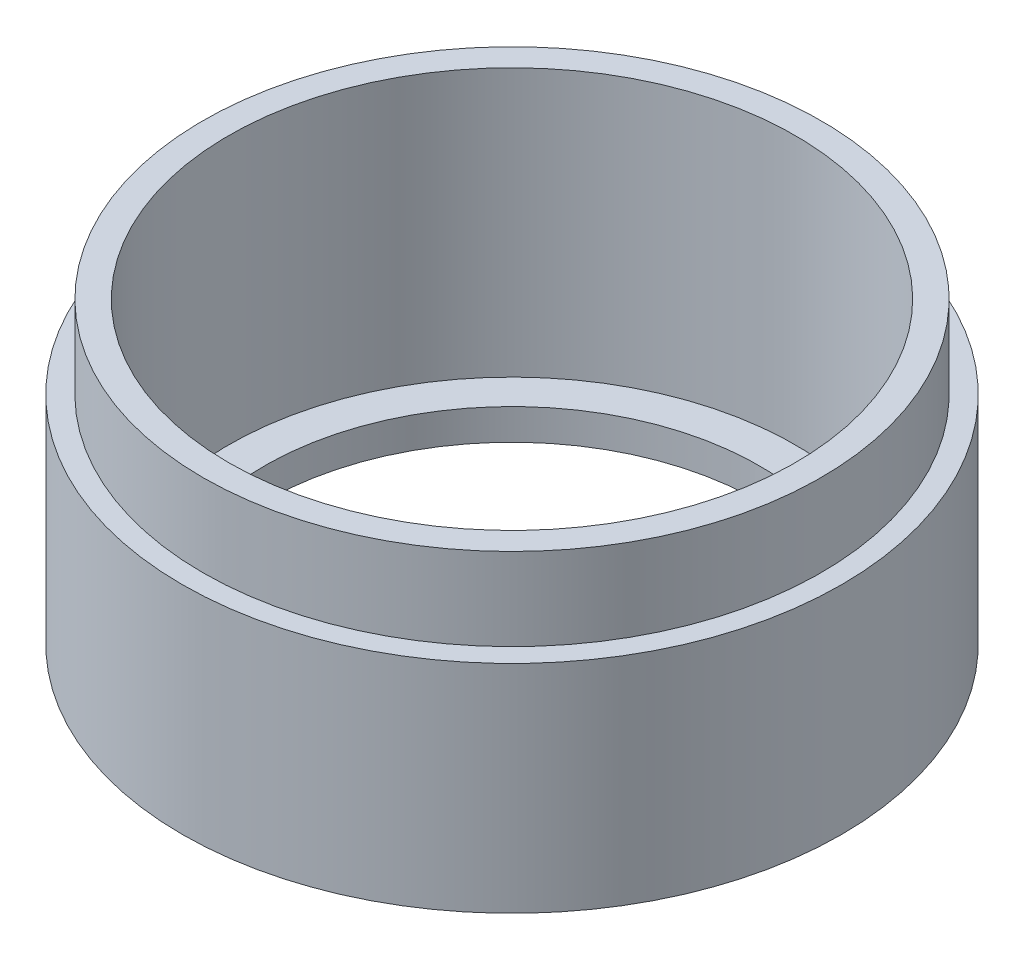
ISO-10303-21;
HEADER;
FILE_DESCRIPTION(('STEP AP214'),'2;1');
FILE_NAME('part.step','',(''),(''),'','','');
FILE_SCHEMA(('AUTOMOTIVE_DESIGN { 1 0 10303 214 1 1 1 1 }'));
ENDSEC;
DATA;
#1=APPLICATION_CONTEXT('core data for automotive mechanical design processes');
#2=APPLICATION_PROTOCOL_DEFINITION('international standard','automotive_design',2000,#1);
#3=PRODUCT_CONTEXT('',#1,'mechanical');
#4=PRODUCT('Part','Part','',(#3));
#5=PRODUCT_RELATED_PRODUCT_CATEGORY('part','',(#4));
#6=PRODUCT_DEFINITION_FORMATION('','',#4);
#7=PRODUCT_DEFINITION_CONTEXT('part definition',#1,'design');
#8=PRODUCT_DEFINITION('design','',#6,#7);
#9=PRODUCT_DEFINITION_SHAPE('','',#8);
#10=(LENGTH_UNIT() NAMED_UNIT(*) SI_UNIT(.MILLI.,.METRE.));
#11=(NAMED_UNIT(*) PLANE_ANGLE_UNIT() SI_UNIT($,.RADIAN.));
#12=(NAMED_UNIT(*) SI_UNIT($,.STERADIAN.) SOLID_ANGLE_UNIT());
#13=UNCERTAINTY_MEASURE_WITH_UNIT(LENGTH_MEASURE(1.E-05),#10,'distance_accuracy_value','');
#14=(GEOMETRIC_REPRESENTATION_CONTEXT(3) GLOBAL_UNCERTAINTY_ASSIGNED_CONTEXT((#13)) GLOBAL_UNIT_ASSIGNED_CONTEXT((#10,
#11,#12)) REPRESENTATION_CONTEXT('',''));
#15=CARTESIAN_POINT('',(0.,0.,0.));
#16=DIRECTION('',(0.,0.,1.));
#17=DIRECTION('',(1.,0.,0.));
#18=AXIS2_PLACEMENT_3D('',#15,#16,#17);
#19=CARTESIAN_POINT('',(32.,-49.4943699492636,0.));
#20=DIRECTION('',(0.,1.,0.));
#21=DIRECTION('',(0.,0.,1.));
#22=AXIS2_PLACEMENT_3D('',#19,#20,#21);
#23=PLANE('',#22);
#24=CARTESIAN_POINT('',(0.,-49.4943699492636,0.));
#25=DIRECTION('',(0.,1.,0.));
#26=DIRECTION('',(0.,0.,1.));
#27=AXIS2_PLACEMENT_3D('',#24,#25,#26);
#28=CIRCLE('',#27,32.);
#29=CARTESIAN_POINT('',(0.,-49.4943699492636,32.));
#30=VERTEX_POINT('',#29);
#31=EDGE_CURVE('E10',#30,#30,#28,.T.);
#32=ORIENTED_EDGE('',*,*,#31,.F.);
#33=EDGE_LOOP('',(#32));
#34=FACE_BOUND('',#33,.T.);
#35=CARTESIAN_POINT('',(0.,-49.4943699492636,0.));
#36=DIRECTION('',(0.,1.,0.));
#37=DIRECTION('',(0.,0.,1.));
#38=AXIS2_PLACEMENT_3D('',#35,#36,#37);
#39=CIRCLE('',#38,24.);
#40=CARTESIAN_POINT('',(0.,-49.4943699492636,24.));
#41=VERTEX_POINT('',#40);
#42=EDGE_CURVE('E58',#41,#41,#39,.T.);
#43=ORIENTED_EDGE('',*,*,#42,.T.);
#44=EDGE_LOOP('',(#43));
#45=FACE_BOUND('',#44,.T.);
#46=ADVANCED_FACE('F30',(#34,#45),#23,.F.);
#47=CARTESIAN_POINT('',(0.,46.0251937984496,0.));
#48=DIRECTION('',(0.,1.,0.));
#49=DIRECTION('',(0.,0.,1.));
#50=AXIS2_PLACEMENT_3D('',#47,#48,#49);
#51=CYLINDRICAL_SURFACE('',#50,32.);
#52=CARTESIAN_POINT('',(0.,-28.4943699492636,0.));
#53=DIRECTION('',(0.,1.,0.));
#54=DIRECTION('',(0.,0.,1.));
#55=AXIS2_PLACEMENT_3D('',#52,#53,#54);
#56=CIRCLE('',#55,32.);
#57=CARTESIAN_POINT('',(0.,-28.4943699492636,32.));
#58=VERTEX_POINT('',#57);
#59=EDGE_CURVE('E36',#58,#58,#56,.T.);
#60=ORIENTED_EDGE('',*,*,#59,.F.);
#61=EDGE_LOOP('',(#60));
#62=FACE_BOUND('',#61,.T.);
#63=ORIENTED_EDGE('',*,*,#31,.T.);
#64=EDGE_LOOP('',(#63));
#65=FACE_BOUND('',#64,.T.);
#66=ADVANCED_FACE('F95',(#62,#65),#51,.T.);
#67=CARTESIAN_POINT('',(30.,-28.4943699492636,0.));
#68=DIRECTION('',(0.,-1.,0.));
#69=DIRECTION('',(0.,0.,-1.));
#70=AXIS2_PLACEMENT_3D('',#67,#68,#69);
#71=PLANE('',#70);
#72=CARTESIAN_POINT('',(0.,-28.4943699492636,0.));
#73=DIRECTION('',(0.,1.,0.));
#74=DIRECTION('',(0.,0.,1.));
#75=AXIS2_PLACEMENT_3D('',#72,#73,#74);
#76=CIRCLE('',#75,30.);
#77=CARTESIAN_POINT('',(0.,-28.4943699492636,30.));
#78=VERTEX_POINT('',#77);
#79=EDGE_CURVE('E40',#78,#78,#76,.T.);
#80=ORIENTED_EDGE('',*,*,#79,.F.);
#81=EDGE_LOOP('',(#80));
#82=FACE_BOUND('',#81,.T.);
#83=ORIENTED_EDGE('',*,*,#59,.T.);
#84=EDGE_LOOP('',(#83));
#85=FACE_BOUND('',#84,.T.);
#86=ADVANCED_FACE('F90',(#82,#85),#71,.F.);
#87=CARTESIAN_POINT('',(0.,46.0251937984496,0.));
#88=DIRECTION('',(0.,1.,0.));
#89=DIRECTION('',(0.,0.,1.));
#90=AXIS2_PLACEMENT_3D('',#87,#88,#89);
#91=CYLINDRICAL_SURFACE('',#90,30.);
#92=CARTESIAN_POINT('',(0.,-20.4943699492636,0.));
#93=DIRECTION('',(0.,1.,0.));
#94=DIRECTION('',(0.,0.,1.));
#95=AXIS2_PLACEMENT_3D('',#92,#93,#94);
#96=CIRCLE('',#95,30.);
#97=CARTESIAN_POINT('',(0.,-20.4943699492636,30.));
#98=VERTEX_POINT('',#97);
#99=EDGE_CURVE('E44',#98,#98,#96,.T.);
#100=ORIENTED_EDGE('',*,*,#99,.F.);
#101=EDGE_LOOP('',(#100));
#102=FACE_BOUND('',#101,.T.);
#103=ORIENTED_EDGE('',*,*,#79,.T.);
#104=EDGE_LOOP('',(#103));
#105=FACE_BOUND('',#104,.T.);
#106=ADVANCED_FACE('F84',(#102,#105),#91,.T.);
#107=CARTESIAN_POINT('',(27.5,-20.4943699492636,0.));
#108=DIRECTION('',(0.,-1.,0.));
#109=DIRECTION('',(0.,0.,-1.));
#110=AXIS2_PLACEMENT_3D('',#107,#108,#109);
#111=PLANE('',#110);
#112=CARTESIAN_POINT('',(0.,-20.4943699492636,0.));
#113=DIRECTION('',(0.,1.,0.));
#114=DIRECTION('',(0.,0.,1.));
#115=AXIS2_PLACEMENT_3D('',#112,#113,#114);
#116=CIRCLE('',#115,27.5);
#117=CARTESIAN_POINT('',(0.,-20.4943699492636,27.5));
#118=VERTEX_POINT('',#117);
#119=EDGE_CURVE('E49',#118,#118,#116,.T.);
#120=ORIENTED_EDGE('',*,*,#119,.F.);
#121=EDGE_LOOP('',(#120));
#122=FACE_BOUND('',#121,.T.);
#123=ORIENTED_EDGE('',*,*,#99,.T.);
#124=EDGE_LOOP('',(#123));
#125=FACE_BOUND('',#124,.T.);
#126=ADVANCED_FACE('F78',(#122,#125),#111,.F.);
#127=CARTESIAN_POINT('',(0.,46.0251937984496,0.));
#128=DIRECTION('',(0.,1.,0.));
#129=DIRECTION('',(0.,0.,1.));
#130=AXIS2_PLACEMENT_3D('',#127,#128,#129);
#131=CYLINDRICAL_SURFACE('',#130,27.5);
#132=CARTESIAN_POINT('',(0.,-46.4943699492636,0.));
#133=DIRECTION('',(0.,1.,0.));
#134=DIRECTION('',(0.,0.,1.));
#135=AXIS2_PLACEMENT_3D('',#132,#133,#134);
#136=CIRCLE('',#135,27.5);
#137=CARTESIAN_POINT('',(0.,-46.4943699492636,27.5));
#138=VERTEX_POINT('',#137);
#139=EDGE_CURVE('E52',#138,#138,#136,.T.);
#140=ORIENTED_EDGE('',*,*,#139,.F.);
#141=EDGE_LOOP('',(#140));
#142=FACE_BOUND('',#141,.T.);
#143=ORIENTED_EDGE('',*,*,#119,.T.);
#144=EDGE_LOOP('',(#143));
#145=FACE_BOUND('',#144,.T.);
#146=ADVANCED_FACE('F72',(#142,#145),#131,.F.);
#147=CARTESIAN_POINT('',(24.,-46.4943699492636,0.));
#148=DIRECTION('',(0.,-1.,0.));
#149=DIRECTION('',(0.,0.,-1.));
#150=AXIS2_PLACEMENT_3D('',#147,#148,#149);
#151=PLANE('',#150);
#152=CARTESIAN_POINT('',(0.,-46.4943699492636,0.));
#153=DIRECTION('',(0.,1.,0.));
#154=DIRECTION('',(0.,0.,1.));
#155=AXIS2_PLACEMENT_3D('',#152,#153,#154);
#156=CIRCLE('',#155,24.);
#157=CARTESIAN_POINT('',(0.,-46.4943699492636,24.));
#158=VERTEX_POINT('',#157);
#159=EDGE_CURVE('E55',#158,#158,#156,.T.);
#160=ORIENTED_EDGE('',*,*,#159,.F.);
#161=EDGE_LOOP('',(#160));
#162=FACE_BOUND('',#161,.T.);
#163=ORIENTED_EDGE('',*,*,#139,.T.);
#164=EDGE_LOOP('',(#163));
#165=FACE_BOUND('',#164,.T.);
#166=ADVANCED_FACE('F66',(#162,#165),#151,.F.);
#167=CARTESIAN_POINT('',(0.,46.0251937984496,0.));
#168=DIRECTION('',(0.,1.,0.));
#169=DIRECTION('',(0.,0.,1.));
#170=AXIS2_PLACEMENT_3D('',#167,#168,#169);
#171=CYLINDRICAL_SURFACE('',#170,24.);
#172=ORIENTED_EDGE('',*,*,#42,.F.);
#173=EDGE_LOOP('',(#172));
#174=FACE_BOUND('',#173,.T.);
#175=ORIENTED_EDGE('',*,*,#159,.T.);
#176=EDGE_LOOP('',(#175));
#177=FACE_BOUND('',#176,.T.);
#178=ADVANCED_FACE('F63',(#174,#177),#171,.F.);
#179=CLOSED_SHELL('',(#46,#66,#86,#106,#126,#146,#166,#178));
#180=MANIFOLD_SOLID_BREP('B2',#179);
#181=ADVANCED_BREP_SHAPE_REPRESENTATION('',(#18,#180),#14);
#182=SHAPE_DEFINITION_REPRESENTATION(#9,#181);
ENDSEC;
END-ISO-10303-21;
